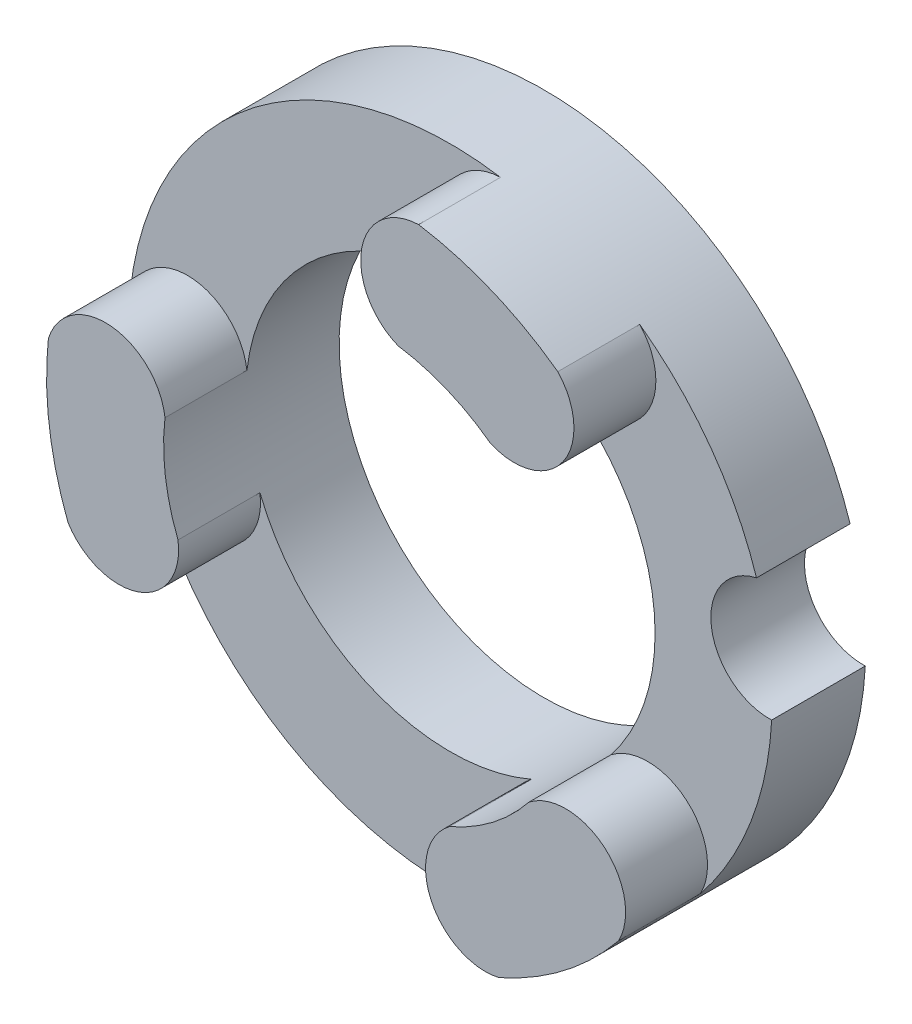
ISO-10303-21;
HEADER;
FILE_DESCRIPTION(('STEP AP214'),'2;1');
FILE_NAME('part.step','',(''),(''),'','','');
FILE_SCHEMA(('AUTOMOTIVE_DESIGN { 1 0 10303 214 1 1 1 1 }'));
ENDSEC;
DATA;
#1=APPLICATION_CONTEXT('core data for automotive mechanical design processes');
#2=APPLICATION_PROTOCOL_DEFINITION('international standard','automotive_design',2000,#1);
#3=PRODUCT_CONTEXT('',#1,'mechanical');
#4=PRODUCT('Part','Part','',(#3));
#5=PRODUCT_RELATED_PRODUCT_CATEGORY('part','',(#4));
#6=PRODUCT_DEFINITION_FORMATION('','',#4);
#7=PRODUCT_DEFINITION_CONTEXT('part definition',#1,'design');
#8=PRODUCT_DEFINITION('design','',#6,#7);
#9=PRODUCT_DEFINITION_SHAPE('','',#8);
#10=(LENGTH_UNIT() NAMED_UNIT(*) SI_UNIT(.MILLI.,.METRE.));
#11=(NAMED_UNIT(*) PLANE_ANGLE_UNIT() SI_UNIT($,.RADIAN.));
#12=(NAMED_UNIT(*) SI_UNIT($,.STERADIAN.) SOLID_ANGLE_UNIT());
#13=UNCERTAINTY_MEASURE_WITH_UNIT(LENGTH_MEASURE(1.E-05),#10,'distance_accuracy_value','');
#14=(GEOMETRIC_REPRESENTATION_CONTEXT(3) GLOBAL_UNCERTAINTY_ASSIGNED_CONTEXT((#13)) GLOBAL_UNIT_ASSIGNED_CONTEXT((#10,
#11,#12)) REPRESENTATION_CONTEXT('',''));
#15=CARTESIAN_POINT('',(0.,0.,0.));
#16=DIRECTION('',(0.,0.,1.));
#17=DIRECTION('',(1.,0.,0.));
#18=AXIS2_PLACEMENT_3D('',#15,#16,#17);
#19=CARTESIAN_POINT('',(0.,0.,8.));
#20=DIRECTION('',(0.,0.,1.));
#21=DIRECTION('',(1.,0.,0.));
#22=AXIS2_PLACEMENT_3D('',#19,#20,#21);
#23=PLANE('',#22);
#24=CARTESIAN_POINT('',(27.2660428698019,3.5795120089374,8.));
#25=DIRECTION('',(0.,0.,1.));
#26=DIRECTION('',(1.,0.,0.));
#27=AXIS2_PLACEMENT_3D('',#24,#25,#26);
#28=CIRCLE('',#27,5.);
#29=CARTESIAN_POINT('',(26.167239029919,8.45728097860566,8.));
#30=VERTEX_POINT('',#29);
#31=CARTESIAN_POINT('',(27.4634899206004,-1.41658793623293,8.));
#32=VERTEX_POINT('',#31);
#33=EDGE_CURVE('E153',#30,#32,#28,.T.);
#34=ORIENTED_EDGE('',*,*,#33,.F.);
#35=CARTESIAN_POINT('',(0.,0.,8.));
#36=DIRECTION('',(0.,0.,1.));
#37=DIRECTION('',(1.,0.,0.));
#38=AXIS2_PLACEMENT_3D('',#35,#36,#37);
#39=CIRCLE('',#38,27.5);
#40=CARTESIAN_POINT('',(16.1875637111752,22.2308969926236,8.));
#41=VERTEX_POINT('',#40);
#42=EDGE_CURVE('E163',#30,#41,#39,.T.);
#43=ORIENTED_EDGE('',*,*,#42,.T.);
#44=CARTESIAN_POINT('',(12.4568638666666,18.7370366549072,8.));
#45=DIRECTION('',(0.,0.,1.));
#46=DIRECTION('',(1.,0.,0.));
#47=AXIS2_PLACEMENT_3D('',#44,#45,#46);
#48=CIRCLE('',#47,5.11127981911426);
#49=CARTESIAN_POINT('',(10.453586197285,14.0346904353439,8.));
#50=VERTEX_POINT('',#49);
#51=EDGE_CURVE('E241',#50,#41,#48,.T.);
#52=ORIENTED_EDGE('',*,*,#51,.F.);
#53=CARTESIAN_POINT('',(0.,0.,8.));
#54=DIRECTION('',(0.,0.,1.));
#55=DIRECTION('',(1.,0.,0.));
#56=AXIS2_PLACEMENT_3D('',#53,#54,#55);
#57=CIRCLE('',#56,17.5);
#58=CARTESIAN_POINT('',(13.7219041531095,-10.8609090969806,8.));
#59=VERTEX_POINT('',#58);
#60=EDGE_CURVE('E220',#59,#50,#57,.T.);
#61=ORIENTED_EDGE('',*,*,#60,.F.);
#62=CARTESIAN_POINT('',(16.8710385660155,-14.8868417639208,8.));
#63=DIRECTION('',(0.,0.,1.));
#64=DIRECTION('',(1.,0.,0.));
#65=AXIS2_PLACEMENT_3D('',#62,#63,#64);
#66=CIRCLE('',#65,5.11127981911431);
#67=CARTESIAN_POINT('',(21.3771344162771,-17.2993677384007,8.));
#68=VERTEX_POINT('',#67);
#69=EDGE_CURVE('E323',#68,#59,#66,.T.);
#70=ORIENTED_EDGE('',*,*,#69,.F.);
#71=EDGE_CURVE('E167',#68,#32,#39,.T.);
#72=ORIENTED_EDGE('',*,*,#71,.T.);
#73=EDGE_LOOP('',(#34,#43,#52,#61,#70,#72));
#74=FACE_BOUND('',#73,.T.);
#75=ADVANCED_FACE('F51',(#74),#23,.T.);
#76=CARTESIAN_POINT('',(2.54487110962398,17.3139721333783,8.));
#77=VERTEX_POINT('',#76);
#78=CARTESIAN_POINT('',(-17.3811915499008,2.03572598982741,8.));
#79=VERTEX_POINT('',#78);
#80=EDGE_CURVE('E221',#77,#79,#57,.T.);
#81=ORIENTED_EDGE('',*,*,#80,.F.);
#82=CARTESIAN_POINT('',(4.45686386666681,22.0541688683568,8.));
#83=DIRECTION('',(0.,0.,1.));
#84=DIRECTION('',(1.,0.,0.));
#85=AXIS2_PLACEMENT_3D('',#82,#83,#84);
#86=CIRCLE('',#85,5.11127981911431);
#87=CARTESIAN_POINT('',(4.29312472272543,27.162825333811,8.));
#88=VERTEX_POINT('',#87);
#89=EDGE_CURVE('E248',#88,#77,#86,.T.);
#90=ORIENTED_EDGE('',*,*,#89,.F.);
#91=CARTESIAN_POINT('',(-27.3463034001147,2.9033929029454,8.));
#92=VERTEX_POINT('',#91);
#93=EDGE_CURVE('E175',#88,#92,#39,.T.);
#94=ORIENTED_EDGE('',*,*,#93,.T.);
#95=CARTESIAN_POINT('',(-22.4551816681231,1.41944223256437,8.));
#96=DIRECTION('',(0.,0.,1.));
#97=DIRECTION('',(1.,0.,0.));
#98=AXIS2_PLACEMENT_3D('',#95,#96,#97);
#99=CIRCLE('',#98,5.11127981911426);
#100=EDGE_CURVE('E267',#79,#92,#99,.T.);
#101=ORIENTED_EDGE('',*,*,#100,.F.);
#102=EDGE_LOOP('',(#81,#90,#94,#101));
#103=FACE_BOUND('',#102,.T.);
#104=ADVANCED_FACE('F297',(#103),#23,.T.);
#105=CARTESIAN_POINT('',(-25.6702591390025,-9.86345759541026,8.));
#106=VERTEX_POINT('',#105);
#107=CARTESIAN_POINT('',(11.1587396889393,-25.1342898955688,8.));
#108=VERTEX_POINT('',#107);
#109=EDGE_CURVE('E159',#106,#108,#39,.T.);
#110=ORIENTED_EDGE('',*,*,#109,.T.);
#111=CARTESIAN_POINT('',(9.99831780145642,-20.1564788874714,8.));
#112=DIRECTION('',(0.,0.,1.));
#113=DIRECTION('',(1.,0.,0.));
#114=AXIS2_PLACEMENT_3D('',#111,#112,#113);
#115=CIRCLE('',#114,5.11127981911426);
#116=CARTESIAN_POINT('',(6.92760535261569,-16.0704164251711,8.));
#117=VERTEX_POINT('',#116);
#118=EDGE_CURVE('E188',#117,#108,#115,.T.);
#119=ORIENTED_EDGE('',*,*,#118,.F.);
#120=CARTESIAN_POINT('',(-16.2667752627335,-6.45306303639771,8.));
#121=VERTEX_POINT('',#120);
#122=EDGE_CURVE('E218',#121,#117,#57,.T.);
#123=ORIENTED_EDGE('',*,*,#122,.F.);
#124=CARTESIAN_POINT('',(-21.3279024326823,-7.16732710443602,8.));
#125=DIRECTION('',(0.,0.,1.));
#126=DIRECTION('',(1.,0.,0.));
#127=AXIS2_PLACEMENT_3D('',#124,#125,#126);
#128=CIRCLE('',#127,5.11127981911431);
#129=EDGE_CURVE('E191',#106,#121,#128,.T.);
#130=ORIENTED_EDGE('',*,*,#129,.F.);
#131=EDGE_LOOP('',(#110,#119,#123,#130));
#132=FACE_BOUND('',#131,.T.);
#133=ADVANCED_FACE('F187',(#132),#23,.T.);
#134=CARTESIAN_POINT('',(0.,0.,0.));
#135=DIRECTION('',(0.,0.,1.));
#136=DIRECTION('',(1.,0.,0.));
#137=AXIS2_PLACEMENT_3D('',#134,#135,#136);
#138=PLANE('',#137);
#139=CARTESIAN_POINT('',(0.,0.,0.));
#140=DIRECTION('',(0.,0.,1.));
#141=DIRECTION('',(1.,0.,0.));
#142=AXIS2_PLACEMENT_3D('',#139,#140,#141);
#143=CIRCLE('',#142,27.5);
#144=CARTESIAN_POINT('',(26.167239029919,8.45728097860566,0.));
#145=VERTEX_POINT('',#144);
#146=CARTESIAN_POINT('',(27.4634899206004,-1.41658793623293,0.));
#147=VERTEX_POINT('',#146);
#148=EDGE_CURVE('E179',#145,#147,#143,.T.);
#149=ORIENTED_EDGE('',*,*,#148,.F.);
#150=CARTESIAN_POINT('',(27.2660428698019,3.5795120089374,0.));
#151=DIRECTION('',(0.,0.,1.));
#152=DIRECTION('',(1.,0.,0.));
#153=AXIS2_PLACEMENT_3D('',#150,#151,#152);
#154=CIRCLE('',#153,5.);
#155=EDGE_CURVE('E67',#145,#147,#154,.T.);
#156=ORIENTED_EDGE('',*,*,#155,.T.);
#157=EDGE_LOOP('',(#149,#156));
#158=FACE_BOUND('',#157,.T.);
#159=CARTESIAN_POINT('',(0.,0.,0.));
#160=DIRECTION('',(0.,0.,1.));
#161=DIRECTION('',(1.,0.,0.));
#162=AXIS2_PLACEMENT_3D('',#159,#160,#161);
#163=CIRCLE('',#162,17.5);
#164=CARTESIAN_POINT('',(17.5,0.,0.));
#165=VERTEX_POINT('',#164);
#166=EDGE_CURVE('E212',#165,#165,#163,.T.);
#167=ORIENTED_EDGE('',*,*,#166,.T.);
#168=EDGE_LOOP('',(#167));
#169=FACE_BOUND('',#168,.T.);
#170=ADVANCED_FACE('F339',(#158,#169),#138,.F.);
#171=CARTESIAN_POINT('',(0.,0.,8.));
#172=DIRECTION('',(0.,0.,-1.));
#173=DIRECTION('',(-1.,0.,0.));
#174=AXIS2_PLACEMENT_3D('',#171,#172,#173);
#175=CYLINDRICAL_SURFACE('',#174,27.5);
#176=ORIENTED_EDGE('',*,*,#148,.T.);
#177=DIRECTION('',(0.,0.,1.));
#178=VECTOR('',#177,1.);
#179=CARTESIAN_POINT('',(27.4634899206004,-1.41658793623293,4.));
#180=LINE('',#179,#178);
#181=EDGE_CURVE('E11',#147,#32,#180,.T.);
#182=ORIENTED_EDGE('',*,*,#181,.T.);
#183=ORIENTED_EDGE('',*,*,#71,.F.);
#184=DIRECTION('',(0.,0.,-1.));
#185=VECTOR('',#184,1.);
#186=CARTESIAN_POINT('',(21.3771344162771,-17.2993677384007,15.));
#187=LINE('',#186,#185);
#188=CARTESIAN_POINT('',(21.3771344162771,-17.2993677384007,15.));
#189=VERTEX_POINT('',#188);
#190=EDGE_CURVE('E256',#189,#68,#187,.T.);
#191=ORIENTED_EDGE('',*,*,#190,.F.);
#192=CARTESIAN_POINT('',(0.,0.,15.));
#193=DIRECTION('',(0.,0.,1.));
#194=DIRECTION('',(1.,0.,0.));
#195=AXIS2_PLACEMENT_3D('',#192,#193,#194);
#196=CIRCLE('',#195,27.5);
#197=CARTESIAN_POINT('',(11.1587396889393,-25.1342898955688,15.));
#198=VERTEX_POINT('',#197);
#199=EDGE_CURVE('E322',#198,#189,#196,.T.);
#200=ORIENTED_EDGE('',*,*,#199,.F.);
#201=DIRECTION('',(0.,0.,-1.));
#202=VECTOR('',#201,1.);
#203=CARTESIAN_POINT('',(11.1587396889393,-25.1342898955688,15.));
#204=LINE('',#203,#202);
#205=EDGE_CURVE('E199',#198,#108,#204,.T.);
#206=ORIENTED_EDGE('',*,*,#205,.T.);
#207=ORIENTED_EDGE('',*,*,#109,.F.);
#208=DIRECTION('',(0.,0.,-1.));
#209=VECTOR('',#208,1.);
#210=CARTESIAN_POINT('',(-25.6702591390025,-9.86345759541026,15.));
#211=LINE('',#210,#209);
#212=CARTESIAN_POINT('',(-25.6702591390025,-9.86345759541026,15.));
#213=VERTEX_POINT('',#212);
#214=EDGE_CURVE('E195',#213,#106,#211,.T.);
#215=ORIENTED_EDGE('',*,*,#214,.F.);
#216=CARTESIAN_POINT('',(0.,0.,15.));
#217=DIRECTION('',(0.,0.,1.));
#218=DIRECTION('',(1.,0.,0.));
#219=AXIS2_PLACEMENT_3D('',#216,#217,#218);
#220=CIRCLE('',#219,27.5);
#221=CARTESIAN_POINT('',(-27.3463034001147,2.9033929029454,15.));
#222=VERTEX_POINT('',#221);
#223=EDGE_CURVE('E272',#222,#213,#220,.T.);
#224=ORIENTED_EDGE('',*,*,#223,.F.);
#225=DIRECTION('',(0.,0.,-1.));
#226=VECTOR('',#225,1.);
#227=CARTESIAN_POINT('',(-27.3463034001147,2.9033929029454,15.));
#228=LINE('',#227,#226);
#229=EDGE_CURVE('E206',#222,#92,#228,.T.);
#230=ORIENTED_EDGE('',*,*,#229,.T.);
#231=ORIENTED_EDGE('',*,*,#93,.F.);
#232=DIRECTION('',(0.,0.,-1.));
#233=VECTOR('',#232,1.);
#234=CARTESIAN_POINT('',(4.29312472272543,27.162825333811,15.));
#235=LINE('',#234,#233);
#236=CARTESIAN_POINT('',(4.29312472272543,27.162825333811,15.));
#237=VERTEX_POINT('',#236);
#238=EDGE_CURVE('E264',#237,#88,#235,.T.);
#239=ORIENTED_EDGE('',*,*,#238,.F.);
#240=CARTESIAN_POINT('',(0.,0.,15.));
#241=DIRECTION('',(0.,0.,1.));
#242=DIRECTION('',(1.,0.,0.));
#243=AXIS2_PLACEMENT_3D('',#240,#241,#242);
#244=CIRCLE('',#243,27.5);
#245=CARTESIAN_POINT('',(16.1875637111752,22.2308969926236,15.));
#246=VERTEX_POINT('',#245);
#247=EDGE_CURVE('E247',#246,#237,#244,.T.);
#248=ORIENTED_EDGE('',*,*,#247,.F.);
#249=DIRECTION('',(0.,0.,-1.));
#250=VECTOR('',#249,1.);
#251=CARTESIAN_POINT('',(16.1875637111752,22.2308969926236,15.));
#252=LINE('',#251,#250);
#253=EDGE_CURVE('E173',#246,#41,#252,.T.);
#254=ORIENTED_EDGE('',*,*,#253,.T.);
#255=ORIENTED_EDGE('',*,*,#42,.F.);
#256=DIRECTION('',(0.,0.,1.));
#257=VECTOR('',#256,1.);
#258=CARTESIAN_POINT('',(26.167239029919,8.45728097860566,4.));
#259=LINE('',#258,#257);
#260=EDGE_CURVE('E60',#30,#145,#259,.F.);
#261=ORIENTED_EDGE('',*,*,#260,.T.);
#262=EDGE_LOOP('',(#176,#182,#183,#191,#200,#206,#207,#215,#224,#230,#231,#239,#248,#254,#255,#261));
#263=FACE_BOUND('',#262,.T.);
#264=ADVANCED_FACE('F53',(#263),#175,.T.);
#265=CARTESIAN_POINT('',(0.,0.,8.));
#266=DIRECTION('',(0.,0.,-1.));
#267=DIRECTION('',(-1.,0.,0.));
#268=AXIS2_PLACEMENT_3D('',#265,#266,#267);
#269=CYLINDRICAL_SURFACE('',#268,17.5);
#270=ORIENTED_EDGE('',*,*,#122,.T.);
#271=DIRECTION('',(0.,0.,-1.));
#272=VECTOR('',#271,1.);
#273=CARTESIAN_POINT('',(6.92760535261569,-16.0704164251711,15.));
#274=LINE('',#273,#272);
#275=CARTESIAN_POINT('',(6.92760535261569,-16.0704164251711,15.));
#276=VERTEX_POINT('',#275);
#277=EDGE_CURVE('E314',#276,#117,#274,.T.);
#278=ORIENTED_EDGE('',*,*,#277,.F.);
#279=CARTESIAN_POINT('',(0.,0.,15.));
#280=DIRECTION('',(0.,0.,1.));
#281=DIRECTION('',(1.,0.,0.));
#282=AXIS2_PLACEMENT_3D('',#279,#280,#281);
#283=CIRCLE('',#282,17.5);
#284=CARTESIAN_POINT('',(13.7219041531095,-10.8609090969806,15.));
#285=VERTEX_POINT('',#284);
#286=EDGE_CURVE('E328',#285,#276,#283,.F.);
#287=ORIENTED_EDGE('',*,*,#286,.F.);
#288=DIRECTION('',(0.,0.,-1.));
#289=VECTOR('',#288,1.);
#290=CARTESIAN_POINT('',(13.7219041531095,-10.8609090969806,15.));
#291=LINE('',#290,#289);
#292=EDGE_CURVE('E75',#285,#59,#291,.T.);
#293=ORIENTED_EDGE('',*,*,#292,.T.);
#294=ORIENTED_EDGE('',*,*,#60,.T.);
#295=DIRECTION('',(0.,0.,-1.));
#296=VECTOR('',#295,1.);
#297=CARTESIAN_POINT('',(10.453586197285,14.0346904353439,15.));
#298=LINE('',#297,#296);
#299=CARTESIAN_POINT('',(10.453586197285,14.0346904353439,15.));
#300=VERTEX_POINT('',#299);
#301=EDGE_CURVE('E237',#300,#50,#298,.T.);
#302=ORIENTED_EDGE('',*,*,#301,.F.);
#303=CARTESIAN_POINT('',(0.,0.,15.));
#304=DIRECTION('',(0.,0.,1.));
#305=DIRECTION('',(1.,0.,0.));
#306=AXIS2_PLACEMENT_3D('',#303,#304,#305);
#307=CIRCLE('',#306,17.5);
#308=CARTESIAN_POINT('',(2.54487110962398,17.3139721333783,15.));
#309=VERTEX_POINT('',#308);
#310=EDGE_CURVE('E303',#309,#300,#307,.F.);
#311=ORIENTED_EDGE('',*,*,#310,.F.);
#312=DIRECTION('',(0.,0.,-1.));
#313=VECTOR('',#312,1.);
#314=CARTESIAN_POINT('',(2.54487110962398,17.3139721333783,15.));
#315=LINE('',#314,#313);
#316=EDGE_CURVE('E244',#309,#77,#315,.T.);
#317=ORIENTED_EDGE('',*,*,#316,.T.);
#318=ORIENTED_EDGE('',*,*,#80,.T.);
#319=DIRECTION('',(0.,0.,-1.));
#320=VECTOR('',#319,1.);
#321=CARTESIAN_POINT('',(-17.3811915499008,2.03572598982741,15.));
#322=LINE('',#321,#320);
#323=CARTESIAN_POINT('',(-17.3811915499008,2.03572598982741,15.));
#324=VERTEX_POINT('',#323);
#325=EDGE_CURVE('E214',#324,#79,#322,.T.);
#326=ORIENTED_EDGE('',*,*,#325,.F.);
#327=CARTESIAN_POINT('',(0.,0.,15.));
#328=DIRECTION('',(0.,0.,1.));
#329=DIRECTION('',(1.,0.,0.));
#330=AXIS2_PLACEMENT_3D('',#327,#328,#329);
#331=CIRCLE('',#330,17.5);
#332=CARTESIAN_POINT('',(-16.2667752627335,-6.45306303639771,15.));
#333=VERTEX_POINT('',#332);
#334=EDGE_CURVE('E277',#333,#324,#331,.F.);
#335=ORIENTED_EDGE('',*,*,#334,.F.);
#336=DIRECTION('',(0.,0.,-1.));
#337=VECTOR('',#336,1.);
#338=CARTESIAN_POINT('',(-16.2667752627335,-6.45306303639771,15.));
#339=LINE('',#338,#337);
#340=EDGE_CURVE('E207',#333,#121,#339,.T.);
#341=ORIENTED_EDGE('',*,*,#340,.T.);
#342=EDGE_LOOP('',(#270,#278,#287,#293,#294,#302,#311,#317,#318,#326,#335,#341));
#343=FACE_BOUND('',#342,.T.);
#344=ORIENTED_EDGE('',*,*,#166,.F.);
#345=EDGE_LOOP('',(#344));
#346=FACE_BOUND('',#345,.T.);
#347=ADVANCED_FACE('F234',(#343,#346),#269,.F.);
#348=CARTESIAN_POINT('',(-22.4551816681231,1.41944223256437,15.));
#349=DIRECTION('',(0.,0.,-1.));
#350=DIRECTION('',(-1.,0.,0.));
#351=AXIS2_PLACEMENT_3D('',#348,#349,#350);
#352=CYLINDRICAL_SURFACE('',#351,5.11127981911426);
#353=ORIENTED_EDGE('',*,*,#100,.T.);
#354=ORIENTED_EDGE('',*,*,#229,.F.);
#355=CARTESIAN_POINT('',(-22.4551816681231,1.41944223256437,15.));
#356=DIRECTION('',(0.,0.,1.));
#357=DIRECTION('',(1.,0.,0.));
#358=AXIS2_PLACEMENT_3D('',#355,#356,#357);
#359=CIRCLE('',#358,5.11127981911426);
#360=EDGE_CURVE('E268',#324,#222,#359,.T.);
#361=ORIENTED_EDGE('',*,*,#360,.F.);
#362=ORIENTED_EDGE('',*,*,#325,.T.);
#363=EDGE_LOOP('',(#353,#354,#361,#362));
#364=FACE_BOUND('',#363,.T.);
#365=ADVANCED_FACE('F288',(#364),#352,.T.);
#366=CARTESIAN_POINT('',(-21.3279024326823,-7.16732710443602,15.));
#367=DIRECTION('',(0.,0.,-1.));
#368=DIRECTION('',(-1.,0.,0.));
#369=AXIS2_PLACEMENT_3D('',#366,#367,#368);
#370=CYLINDRICAL_SURFACE('',#369,5.11127981911431);
#371=ORIENTED_EDGE('',*,*,#129,.T.);
#372=ORIENTED_EDGE('',*,*,#340,.F.);
#373=CARTESIAN_POINT('',(-21.3279024326823,-7.16732710443602,15.));
#374=DIRECTION('',(0.,0.,1.));
#375=DIRECTION('',(1.,0.,0.));
#376=AXIS2_PLACEMENT_3D('',#373,#374,#375);
#377=CIRCLE('',#376,5.11127981911431);
#378=EDGE_CURVE('E204',#213,#333,#377,.T.);
#379=ORIENTED_EDGE('',*,*,#378,.F.);
#380=ORIENTED_EDGE('',*,*,#214,.T.);
#381=EDGE_LOOP('',(#371,#372,#379,#380));
#382=FACE_BOUND('',#381,.T.);
#383=ADVANCED_FACE('F201',(#382),#370,.T.);
#384=CARTESIAN_POINT('',(0.,0.,15.));
#385=DIRECTION('',(0.,0.,1.));
#386=DIRECTION('',(1.,0.,0.));
#387=AXIS2_PLACEMENT_3D('',#384,#385,#386);
#388=PLANE('',#387);
#389=ORIENTED_EDGE('',*,*,#360,.T.);
#390=ORIENTED_EDGE('',*,*,#223,.T.);
#391=ORIENTED_EDGE('',*,*,#378,.T.);
#392=ORIENTED_EDGE('',*,*,#334,.T.);
#393=EDGE_LOOP('',(#389,#390,#391,#392));
#394=FACE_BOUND('',#393,.T.);
#395=ADVANCED_FACE('F292',(#394),#388,.T.);
#396=CARTESIAN_POINT('',(4.45686386666681,22.0541688683568,15.));
#397=DIRECTION('',(0.,0.,-1.));
#398=DIRECTION('',(-1.,0.,0.));
#399=AXIS2_PLACEMENT_3D('',#396,#397,#398);
#400=CYLINDRICAL_SURFACE('',#399,5.11127981911431);
#401=ORIENTED_EDGE('',*,*,#89,.T.);
#402=ORIENTED_EDGE('',*,*,#316,.F.);
#403=CARTESIAN_POINT('',(4.45686386666681,22.0541688683568,15.));
#404=DIRECTION('',(0.,0.,1.));
#405=DIRECTION('',(1.,0.,0.));
#406=AXIS2_PLACEMENT_3D('',#403,#404,#405);
#407=CIRCLE('',#406,5.11127981911431);
#408=EDGE_CURVE('E253',#237,#309,#407,.T.);
#409=ORIENTED_EDGE('',*,*,#408,.F.);
#410=ORIENTED_EDGE('',*,*,#238,.T.);
#411=EDGE_LOOP('',(#401,#402,#409,#410));
#412=FACE_BOUND('',#411,.T.);
#413=ADVANCED_FACE('F300',(#412),#400,.T.);
#414=CARTESIAN_POINT('',(12.4568638666666,18.7370366549072,15.));
#415=DIRECTION('',(0.,0.,-1.));
#416=DIRECTION('',(-1.,0.,0.));
#417=AXIS2_PLACEMENT_3D('',#414,#415,#416);
#418=CYLINDRICAL_SURFACE('',#417,5.11127981911426);
#419=ORIENTED_EDGE('',*,*,#51,.T.);
#420=ORIENTED_EDGE('',*,*,#253,.F.);
#421=CARTESIAN_POINT('',(12.4568638666666,18.7370366549072,15.));
#422=DIRECTION('',(0.,0.,1.));
#423=DIRECTION('',(1.,0.,0.));
#424=AXIS2_PLACEMENT_3D('',#421,#422,#423);
#425=CIRCLE('',#424,5.11127981911426);
#426=EDGE_CURVE('E242',#300,#246,#425,.T.);
#427=ORIENTED_EDGE('',*,*,#426,.F.);
#428=ORIENTED_EDGE('',*,*,#301,.T.);
#429=EDGE_LOOP('',(#419,#420,#427,#428));
#430=FACE_BOUND('',#429,.T.);
#431=ADVANCED_FACE('F240',(#430),#418,.T.);
#432=CARTESIAN_POINT('',(0.,0.,15.));
#433=DIRECTION('',(0.,0.,1.));
#434=DIRECTION('',(1.,0.,0.));
#435=AXIS2_PLACEMENT_3D('',#432,#433,#434);
#436=PLANE('',#435);
#437=ORIENTED_EDGE('',*,*,#247,.T.);
#438=ORIENTED_EDGE('',*,*,#408,.T.);
#439=ORIENTED_EDGE('',*,*,#310,.T.);
#440=ORIENTED_EDGE('',*,*,#426,.T.);
#441=EDGE_LOOP('',(#437,#438,#439,#440));
#442=FACE_BOUND('',#441,.T.);
#443=ADVANCED_FACE('F305',(#442),#436,.T.);
#444=CARTESIAN_POINT('',(16.8710385660155,-14.8868417639208,15.));
#445=DIRECTION('',(0.,0.,-1.));
#446=DIRECTION('',(-1.,0.,0.));
#447=AXIS2_PLACEMENT_3D('',#444,#445,#446);
#448=CYLINDRICAL_SURFACE('',#447,5.11127981911431);
#449=ORIENTED_EDGE('',*,*,#69,.T.);
#450=ORIENTED_EDGE('',*,*,#292,.F.);
#451=CARTESIAN_POINT('',(16.8710385660155,-14.8868417639208,15.));
#452=DIRECTION('',(0.,0.,1.));
#453=DIRECTION('',(1.,0.,0.));
#454=AXIS2_PLACEMENT_3D('',#451,#452,#453);
#455=CIRCLE('',#454,5.11127981911431);
#456=EDGE_CURVE('E331',#189,#285,#455,.T.);
#457=ORIENTED_EDGE('',*,*,#456,.F.);
#458=ORIENTED_EDGE('',*,*,#190,.T.);
#459=EDGE_LOOP('',(#449,#450,#457,#458));
#460=FACE_BOUND('',#459,.T.);
#461=ADVANCED_FACE('F343',(#460),#448,.T.);
#462=CARTESIAN_POINT('',(9.99831780145642,-20.1564788874714,15.));
#463=DIRECTION('',(0.,0.,-1.));
#464=DIRECTION('',(-1.,0.,0.));
#465=AXIS2_PLACEMENT_3D('',#462,#463,#464);
#466=CYLINDRICAL_SURFACE('',#465,5.11127981911426);
#467=ORIENTED_EDGE('',*,*,#118,.T.);
#468=ORIENTED_EDGE('',*,*,#205,.F.);
#469=CARTESIAN_POINT('',(9.99831780145642,-20.1564788874714,15.));
#470=DIRECTION('',(0.,0.,1.));
#471=DIRECTION('',(1.,0.,0.));
#472=AXIS2_PLACEMENT_3D('',#469,#470,#471);
#473=CIRCLE('',#472,5.11127981911426);
#474=EDGE_CURVE('E319',#276,#198,#473,.T.);
#475=ORIENTED_EDGE('',*,*,#474,.F.);
#476=ORIENTED_EDGE('',*,*,#277,.T.);
#477=EDGE_LOOP('',(#467,#468,#475,#476));
#478=FACE_BOUND('',#477,.T.);
#479=ADVANCED_FACE('F349',(#478),#466,.T.);
#480=CARTESIAN_POINT('',(0.,0.,15.));
#481=DIRECTION('',(0.,0.,1.));
#482=DIRECTION('',(1.,0.,0.));
#483=AXIS2_PLACEMENT_3D('',#480,#481,#482);
#484=PLANE('',#483);
#485=ORIENTED_EDGE('',*,*,#199,.T.);
#486=ORIENTED_EDGE('',*,*,#456,.T.);
#487=ORIENTED_EDGE('',*,*,#286,.T.);
#488=ORIENTED_EDGE('',*,*,#474,.T.);
#489=EDGE_LOOP('',(#485,#486,#487,#488));
#490=FACE_BOUND('',#489,.T.);
#491=ADVANCED_FACE('F345',(#490),#484,.T.);
#492=CARTESIAN_POINT('',(27.2660428698019,3.5795120089374,0.));
#493=DIRECTION('',(0.,0.,1.));
#494=DIRECTION('',(1.,0.,0.));
#495=AXIS2_PLACEMENT_3D('',#492,#493,#494);
#496=CYLINDRICAL_SURFACE('',#495,5.);
#497=ORIENTED_EDGE('',*,*,#155,.F.);
#498=ORIENTED_EDGE('',*,*,#260,.F.);
#499=ORIENTED_EDGE('',*,*,#33,.T.);
#500=ORIENTED_EDGE('',*,*,#181,.F.);
#501=EDGE_LOOP('',(#497,#498,#499,#500));
#502=FACE_BOUND('',#501,.T.);
#503=ADVANCED_FACE('F152',(#502),#496,.F.);
#504=CLOSED_SHELL('',(#75,#104,#133,#170,#264,#347,#365,#383,#395,#413,#431,#443,#461,#479,#491,#503));
#505=MANIFOLD_SOLID_BREP('B2',#504);
#506=ADVANCED_BREP_SHAPE_REPRESENTATION('',(#18,#505),#14);
#507=SHAPE_DEFINITION_REPRESENTATION(#9,#506);
ENDSEC;
END-ISO-10303-21;
